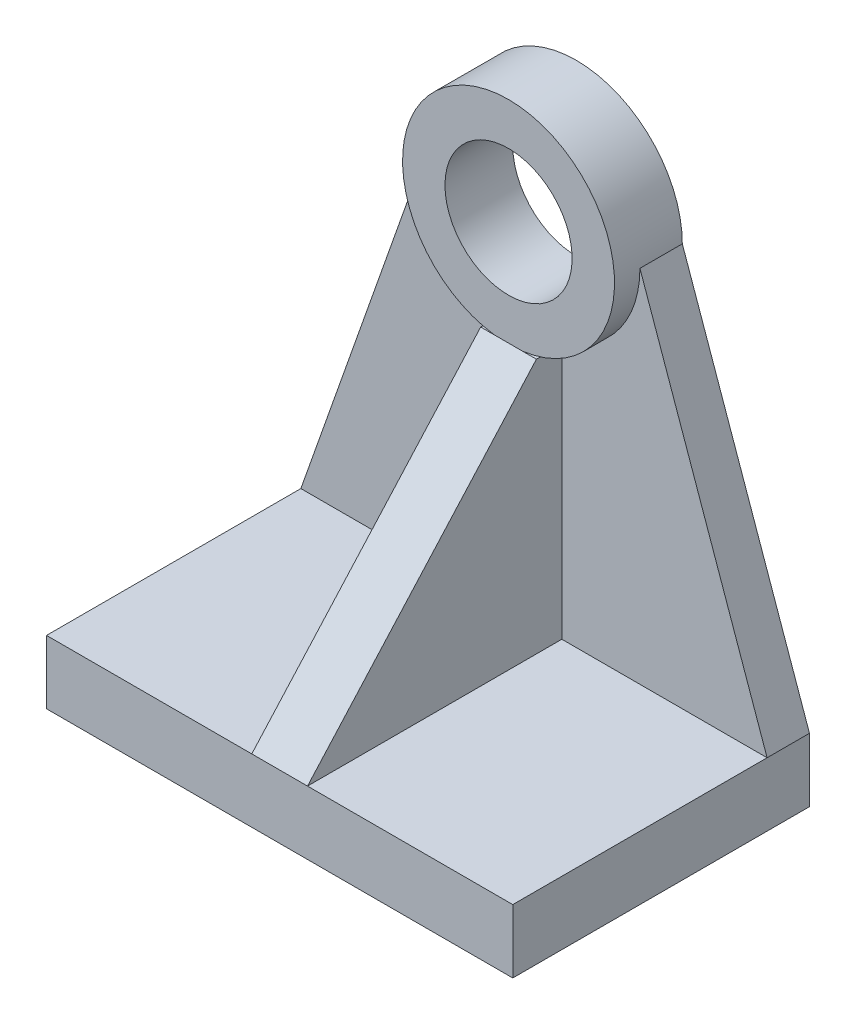
ISO-10303-21;
HEADER;
FILE_DESCRIPTION(('STEP AP214'),'2;1');
FILE_NAME('part.step','',(''),(''),'','','');
FILE_SCHEMA(('AUTOMOTIVE_DESIGN { 1 0 10303 214 1 1 1 1 }'));
ENDSEC;
DATA;
#1=APPLICATION_CONTEXT('core data for automotive mechanical design processes');
#2=APPLICATION_PROTOCOL_DEFINITION('international standard','automotive_design',2000,#1);
#3=PRODUCT_CONTEXT('',#1,'mechanical');
#4=PRODUCT('Part','Part','',(#3));
#5=PRODUCT_RELATED_PRODUCT_CATEGORY('part','',(#4));
#6=PRODUCT_DEFINITION_FORMATION('','',#4);
#7=PRODUCT_DEFINITION_CONTEXT('part definition',#1,'design');
#8=PRODUCT_DEFINITION('design','',#6,#7);
#9=PRODUCT_DEFINITION_SHAPE('','',#8);
#10=(LENGTH_UNIT() NAMED_UNIT(*) SI_UNIT(.MILLI.,.METRE.));
#11=(NAMED_UNIT(*) PLANE_ANGLE_UNIT() SI_UNIT($,.RADIAN.));
#12=(NAMED_UNIT(*) SI_UNIT($,.STERADIAN.) SOLID_ANGLE_UNIT());
#13=UNCERTAINTY_MEASURE_WITH_UNIT(LENGTH_MEASURE(1.E-05),#10,'distance_accuracy_value','');
#14=(GEOMETRIC_REPRESENTATION_CONTEXT(3) GLOBAL_UNCERTAINTY_ASSIGNED_CONTEXT((#13)) GLOBAL_UNIT_ASSIGNED_CONTEXT((#10,
#11,#12)) REPRESENTATION_CONTEXT('',''));
#15=CARTESIAN_POINT('',(0.,0.,0.));
#16=DIRECTION('',(0.,0.,1.));
#17=DIRECTION('',(1.,0.,0.));
#18=AXIS2_PLACEMENT_3D('',#15,#16,#17);
#19=CARTESIAN_POINT('',(0.,95.5294,0.));
#20=DIRECTION('',(0.,-1.,0.));
#21=DIRECTION('',(0.,0.,-1.));
#22=AXIS2_PLACEMENT_3D('',#19,#20,#21);
#23=PLANE('',#22);
#24=DIRECTION('',(0.,0.,1.));
#25=VECTOR('',#24,1.);
#26=CARTESIAN_POINT('',(-8.34981821548547,95.5294,-31.75));
#27=LINE('',#26,#25);
#28=CARTESIAN_POINT('',(-8.34981821548547,95.5294,-31.75));
#29=VERTEX_POINT('',#28);
#30=CARTESIAN_POINT('',(-8.34981821548547,95.5294,-24.13));
#31=VERTEX_POINT('',#30);
#32=EDGE_CURVE('E143',#29,#31,#27,.T.);
#33=ORIENTED_EDGE('',*,*,#32,.T.);
#34=DIRECTION('',(1.,0.,0.));
#35=VECTOR('',#34,1.);
#36=CARTESIAN_POINT('',(0.,95.5294,-24.13));
#37=LINE('',#36,#35);
#38=CARTESIAN_POINT('',(-4.20283661828531,95.5294,-24.13));
#39=VERTEX_POINT('',#38);
#40=EDGE_CURVE('E11',#31,#39,#37,.T.);
#41=ORIENTED_EDGE('',*,*,#40,.T.);
#42=DIRECTION('',(0.,0.,-1.));
#43=VECTOR('',#42,1.);
#44=CARTESIAN_POINT('',(-4.20283661828531,95.5294,-24.13));
#45=LINE('',#44,#43);
#46=CARTESIAN_POINT('',(-4.20283661828531,95.5294,-31.75));
#47=VERTEX_POINT('',#46);
#48=EDGE_CURVE('E165',#47,#39,#45,.F.);
#49=ORIENTED_EDGE('',*,*,#48,.F.);
#50=DIRECTION('',(-1.,0.,0.));
#51=VECTOR('',#50,1.);
#52=CARTESIAN_POINT('',(-8.34981821548547,95.5294,-31.75));
#53=LINE('',#52,#51);
#54=EDGE_CURVE('E148',#47,#29,#53,.T.);
#55=ORIENTED_EDGE('',*,*,#54,.T.);
#56=EDGE_LOOP('',(#33,#41,#49,#55));
#57=FACE_BOUND('',#56,.T.);
#58=ADVANCED_FACE('F35',(#57),#23,.F.);
#59=CARTESIAN_POINT('',(0.,19.05,0.));
#60=DIRECTION('',(0.,-1.,0.));
#61=DIRECTION('',(0.,0.,-1.));
#62=AXIS2_PLACEMENT_3D('',#59,#60,#61);
#63=PLANE('',#62);
#64=DIRECTION('',(0.,0.,1.));
#65=VECTOR('',#64,1.);
#66=CARTESIAN_POINT('',(-8.34981821548547,19.05,-31.75));
#67=LINE('',#66,#65);
#68=CARTESIAN_POINT('',(-8.34981821548547,19.05,-31.75));
#69=VERTEX_POINT('',#68);
#70=CARTESIAN_POINT('',(-8.34981821548547,19.05,44.45));
#71=VERTEX_POINT('',#70);
#72=EDGE_CURVE('E144',#69,#71,#67,.T.);
#73=ORIENTED_EDGE('',*,*,#72,.F.);
#74=DIRECTION('',(-1.,0.,0.));
#75=VECTOR('',#74,1.);
#76=CARTESIAN_POINT('',(0.,19.05,-31.75));
#77=LINE('',#76,#75);
#78=CARTESIAN_POINT('',(-69.85,19.05,-31.75));
#79=VERTEX_POINT('',#78);
#80=EDGE_CURVE('E188',#69,#79,#77,.T.);
#81=ORIENTED_EDGE('',*,*,#80,.T.);
#82=DIRECTION('',(0.,0.,1.));
#83=VECTOR('',#82,1.);
#84=CARTESIAN_POINT('',(-69.85,19.05,44.45));
#85=LINE('',#84,#83);
#86=CARTESIAN_POINT('',(-69.85,19.05,44.45));
#87=VERTEX_POINT('',#86);
#88=EDGE_CURVE('E211',#79,#87,#85,.T.);
#89=ORIENTED_EDGE('',*,*,#88,.T.);
#90=DIRECTION('',(1.,0.,0.));
#91=VECTOR('',#90,1.);
#92=CARTESIAN_POINT('',(-69.85,19.05,44.45));
#93=LINE('',#92,#91);
#94=EDGE_CURVE('E217',#87,#71,#93,.T.);
#95=ORIENTED_EDGE('',*,*,#94,.T.);
#96=EDGE_LOOP('',(#73,#81,#89,#95));
#97=FACE_BOUND('',#96,.T.);
#98=ADVANCED_FACE('F288',(#97),#63,.F.);
#99=DIRECTION('',(0.,0.,-1.));
#100=VECTOR('',#99,1.);
#101=CARTESIAN_POINT('',(8.34981821548553,19.05,-31.75));
#102=LINE('',#101,#100);
#103=CARTESIAN_POINT('',(8.34981821548553,19.05,44.45));
#104=VERTEX_POINT('',#103);
#105=CARTESIAN_POINT('',(8.34981821548553,19.05,-31.75));
#106=VERTEX_POINT('',#105);
#107=EDGE_CURVE('E157',#104,#106,#102,.T.);
#108=ORIENTED_EDGE('',*,*,#107,.F.);
#109=CARTESIAN_POINT('',(69.85,19.05,44.45));
#110=VERTEX_POINT('',#109);
#111=EDGE_CURVE('E216',#104,#110,#93,.T.);
#112=ORIENTED_EDGE('',*,*,#111,.T.);
#113=DIRECTION('',(0.,0.,-1.));
#114=VECTOR('',#113,1.);
#115=CARTESIAN_POINT('',(69.85,19.05,44.45));
#116=LINE('',#115,#114);
#117=CARTESIAN_POINT('',(69.85,19.05,-31.75));
#118=VERTEX_POINT('',#117);
#119=EDGE_CURVE('E208',#110,#118,#116,.T.);
#120=ORIENTED_EDGE('',*,*,#119,.T.);
#121=EDGE_CURVE('E189',#118,#106,#77,.T.);
#122=ORIENTED_EDGE('',*,*,#121,.T.);
#123=EDGE_LOOP('',(#108,#112,#120,#122));
#124=FACE_BOUND('',#123,.T.);
#125=ADVANCED_FACE('F248',(#124),#63,.F.);
#126=CARTESIAN_POINT('',(0.,0.,-31.75));
#127=DIRECTION('',(0.,0.,-1.));
#128=DIRECTION('',(-1.,0.,0.));
#129=AXIS2_PLACEMENT_3D('',#126,#127,#128);
#130=PLANE('',#129);
#131=DIRECTION('',(0.,-1.,0.));
#132=VECTOR('',#131,1.);
#133=CARTESIAN_POINT('',(8.34981821548553,95.5294,-31.75));
#134=LINE('',#133,#132);
#135=CARTESIAN_POINT('',(8.34981821548553,95.5294,-31.75));
#136=VERTEX_POINT('',#135);
#137=EDGE_CURVE('E151',#136,#106,#134,.T.);
#138=ORIENTED_EDGE('',*,*,#137,.T.);
#139=ORIENTED_EDGE('',*,*,#121,.F.);
#140=DIRECTION('',(0.332820117735138,-0.94299033358289,0.));
#141=VECTOR('',#140,1.);
#142=CARTESIAN_POINT('',(68.0915384615385,24.0323076923077,-31.75));
#143=LINE('',#142,#141);
#144=CARTESIAN_POINT('',(31.75,127.,-31.75));
#145=VERTEX_POINT('',#144);
#146=EDGE_CURVE('E184',#145,#118,#143,.T.);
#147=ORIENTED_EDGE('',*,*,#146,.F.);
#148=CARTESIAN_POINT('',(0.,127.,-31.75));
#149=DIRECTION('',(0.,0.,-1.));
#150=DIRECTION('',(-1.,0.,0.));
#151=AXIS2_PLACEMENT_3D('',#148,#149,#150);
#152=CIRCLE('',#151,31.75);
#153=CARTESIAN_POINT('',(4.20283661828531,95.5294,-31.75));
#154=VERTEX_POINT('',#153);
#155=EDGE_CURVE('E181',#145,#154,#152,.T.);
#156=ORIENTED_EDGE('',*,*,#155,.T.);
#157=EDGE_CURVE('E149',#136,#154,#53,.T.);
#158=ORIENTED_EDGE('',*,*,#157,.F.);
#159=EDGE_LOOP('',(#138,#139,#147,#156,#158));
#160=FACE_BOUND('',#159,.T.);
#161=ADVANCED_FACE('F245',(#160),#130,.F.);
#162=DIRECTION('',(0.,-1.,0.));
#163=VECTOR('',#162,1.);
#164=CARTESIAN_POINT('',(-8.34981821548547,95.5294,-31.75));
#165=LINE('',#164,#163);
#166=EDGE_CURVE('E161',#29,#69,#165,.T.);
#167=ORIENTED_EDGE('',*,*,#166,.F.);
#168=ORIENTED_EDGE('',*,*,#54,.F.);
#169=CARTESIAN_POINT('',(-31.75,127.,-31.75));
#170=VERTEX_POINT('',#169);
#171=EDGE_CURVE('E185',#47,#170,#152,.T.);
#172=ORIENTED_EDGE('',*,*,#171,.T.);
#173=DIRECTION('',(0.332820117735137,0.94299033358289,0.));
#174=VECTOR('',#173,1.);
#175=CARTESIAN_POINT('',(-68.0915384615384,24.0323076923077,-31.75));
#176=LINE('',#175,#174);
#177=EDGE_CURVE('E192',#79,#170,#176,.T.);
#178=ORIENTED_EDGE('',*,*,#177,.F.);
#179=ORIENTED_EDGE('',*,*,#80,.F.);
#180=EDGE_LOOP('',(#167,#168,#172,#178,#179));
#181=FACE_BOUND('',#180,.T.);
#182=ADVANCED_FACE('F275',(#181),#130,.F.);
#183=CARTESIAN_POINT('',(0.,127.,-24.13));
#184=DIRECTION('',(0.,0.,-1.));
#185=DIRECTION('',(-1.,0.,0.));
#186=AXIS2_PLACEMENT_3D('',#183,#184,#185);
#187=CYLINDRICAL_SURFACE('',#186,31.75);
#188=ORIENTED_EDGE('',*,*,#171,.F.);
#189=ORIENTED_EDGE('',*,*,#48,.T.);
#190=CARTESIAN_POINT('',(0.,127.,-24.13));
#191=DIRECTION('',(0.,0.,-1.));
#192=DIRECTION('',(-1.,0.,0.));
#193=AXIS2_PLACEMENT_3D('',#190,#191,#192);
#194=CIRCLE('',#193,31.75);
#195=CARTESIAN_POINT('',(4.20283661828531,95.5294,-24.13));
#196=VERTEX_POINT('',#195);
#197=EDGE_CURVE('E175',#39,#196,#194,.T.);
#198=ORIENTED_EDGE('',*,*,#197,.T.);
#199=DIRECTION('',(0.,0.,-1.));
#200=VECTOR('',#199,1.);
#201=CARTESIAN_POINT('',(4.20283661828531,95.5294,-24.13));
#202=LINE('',#201,#200);
#203=EDGE_CURVE('E163',#196,#154,#202,.T.);
#204=ORIENTED_EDGE('',*,*,#203,.T.);
#205=ORIENTED_EDGE('',*,*,#155,.F.);
#206=DIRECTION('',(0.,0.,-1.));
#207=VECTOR('',#206,1.);
#208=CARTESIAN_POINT('',(31.75,127.,-31.75));
#209=LINE('',#208,#207);
#210=CARTESIAN_POINT('',(31.75,127.,-44.45));
#211=VERTEX_POINT('',#210);
#212=EDGE_CURVE('E195',#145,#211,#209,.T.);
#213=ORIENTED_EDGE('',*,*,#212,.T.);
#214=CARTESIAN_POINT('',(0.,127.,-44.45));
#215=DIRECTION('',(0.,0.,-1.));
#216=DIRECTION('',(-1.,0.,0.));
#217=AXIS2_PLACEMENT_3D('',#214,#215,#216);
#218=CIRCLE('',#217,31.75);
#219=CARTESIAN_POINT('',(-31.75,127.,-44.45));
#220=VERTEX_POINT('',#219);
#221=EDGE_CURVE('E172',#220,#211,#218,.T.);
#222=ORIENTED_EDGE('',*,*,#221,.F.);
#223=DIRECTION('',(0.,0.,-1.));
#224=VECTOR('',#223,1.);
#225=CARTESIAN_POINT('',(-31.75,127.,-31.75));
#226=LINE('',#225,#224);
#227=EDGE_CURVE('E201',#170,#220,#226,.T.);
#228=ORIENTED_EDGE('',*,*,#227,.F.);
#229=EDGE_LOOP('',(#188,#189,#198,#204,#205,#213,#222,#228));
#230=FACE_BOUND('',#229,.T.);
#231=ADVANCED_FACE('F267',(#230),#187,.T.);
#232=CARTESIAN_POINT('',(0.,127.,-24.13));
#233=DIRECTION('',(0.,0.,-1.));
#234=DIRECTION('',(-1.,0.,0.));
#235=AXIS2_PLACEMENT_3D('',#232,#233,#234);
#236=PLANE('',#235);
#237=CARTESIAN_POINT('',(0.,127.,-24.13));
#238=DIRECTION('',(0.,0.,-1.));
#239=DIRECTION('',(-1.,0.,0.));
#240=AXIS2_PLACEMENT_3D('',#237,#238,#239);
#241=CIRCLE('',#240,19.05);
#242=CARTESIAN_POINT('',(-19.05,127.,-24.13));
#243=VERTEX_POINT('',#242);
#244=EDGE_CURVE('E169',#243,#243,#241,.T.);
#245=ORIENTED_EDGE('',*,*,#244,.T.);
#246=EDGE_LOOP('',(#245));
#247=FACE_BOUND('',#246,.T.);
#248=DIRECTION('',(-1.,0.,0.));
#249=VECTOR('',#248,1.);
#250=CARTESIAN_POINT('',(0.,95.5294,-24.13));
#251=LINE('',#250,#249);
#252=EDGE_CURVE('E133',#196,#39,#251,.T.);
#253=ORIENTED_EDGE('',*,*,#252,.F.);
#254=ORIENTED_EDGE('',*,*,#197,.F.);
#255=EDGE_LOOP('',(#253,#254));
#256=FACE_BOUND('',#255,.T.);
#257=ADVANCED_FACE('F277',(#247,#256),#236,.F.);
#258=CARTESIAN_POINT('',(69.85,19.05,44.45));
#259=DIRECTION('',(-1.,0.,0.));
#260=DIRECTION('',(0.,0.,1.));
#261=AXIS2_PLACEMENT_3D('',#258,#259,#260);
#262=PLANE('',#261);
#263=DIRECTION('',(0.,0.,-1.));
#264=VECTOR('',#263,1.);
#265=CARTESIAN_POINT('',(69.85,0.,44.45));
#266=LINE('',#265,#264);
#267=CARTESIAN_POINT('',(69.85,0.,44.45));
#268=VERTEX_POINT('',#267);
#269=CARTESIAN_POINT('',(69.85,0.,-44.45));
#270=VERTEX_POINT('',#269);
#271=EDGE_CURVE('E204',#268,#270,#266,.T.);
#272=ORIENTED_EDGE('',*,*,#271,.T.);
#273=DIRECTION('',(0.,-1.,0.));
#274=VECTOR('',#273,1.);
#275=CARTESIAN_POINT('',(69.85,19.05,-44.45));
#276=LINE('',#275,#274);
#277=CARTESIAN_POINT('',(69.85,19.05,-44.45));
#278=VERTEX_POINT('',#277);
#279=EDGE_CURVE('E236',#278,#270,#276,.T.);
#280=ORIENTED_EDGE('',*,*,#279,.F.);
#281=DIRECTION('',(0.,0.,-1.));
#282=VECTOR('',#281,1.);
#283=CARTESIAN_POINT('',(69.85,19.05,-31.75));
#284=LINE('',#283,#282);
#285=EDGE_CURVE('E205',#118,#278,#284,.T.);
#286=ORIENTED_EDGE('',*,*,#285,.F.);
#287=ORIENTED_EDGE('',*,*,#119,.F.);
#288=DIRECTION('',(0.,-1.,0.));
#289=VECTOR('',#288,1.);
#290=CARTESIAN_POINT('',(69.85,19.05,44.45));
#291=LINE('',#290,#289);
#292=EDGE_CURVE('E220',#110,#268,#291,.T.);
#293=ORIENTED_EDGE('',*,*,#292,.T.);
#294=EDGE_LOOP('',(#272,#280,#286,#287,#293));
#295=FACE_BOUND('',#294,.T.);
#296=ADVANCED_FACE('F37',(#295),#262,.F.);
#297=CARTESIAN_POINT('',(-69.85,19.05,-44.45));
#298=DIRECTION('',(0.,0.,1.));
#299=DIRECTION('',(1.,0.,0.));
#300=AXIS2_PLACEMENT_3D('',#297,#298,#299);
#301=PLANE('',#300);
#302=DIRECTION('',(-1.,0.,0.));
#303=VECTOR('',#302,1.);
#304=CARTESIAN_POINT('',(-69.85,0.,-44.45));
#305=LINE('',#304,#303);
#306=CARTESIAN_POINT('',(-69.85,0.,-44.45));
#307=VERTEX_POINT('',#306);
#308=EDGE_CURVE('E223',#270,#307,#305,.T.);
#309=ORIENTED_EDGE('',*,*,#308,.T.);
#310=DIRECTION('',(0.,-1.,0.));
#311=VECTOR('',#310,1.);
#312=CARTESIAN_POINT('',(-69.85,19.05,-44.45));
#313=LINE('',#312,#311);
#314=CARTESIAN_POINT('',(-69.85,19.05,-44.45));
#315=VERTEX_POINT('',#314);
#316=EDGE_CURVE('E233',#315,#307,#313,.T.);
#317=ORIENTED_EDGE('',*,*,#316,.F.);
#318=DIRECTION('',(0.332820117735137,0.94299033358289,0.));
#319=VECTOR('',#318,1.);
#320=CARTESIAN_POINT('',(-68.0915384615384,24.0323076923077,-44.45));
#321=LINE('',#320,#319);
#322=EDGE_CURVE('E198',#315,#220,#321,.T.);
#323=ORIENTED_EDGE('',*,*,#322,.T.);
#324=ORIENTED_EDGE('',*,*,#221,.T.);
#325=DIRECTION('',(0.332820117735138,-0.94299033358289,0.));
#326=VECTOR('',#325,1.);
#327=CARTESIAN_POINT('',(68.0915384615385,24.0323076923077,-44.45));
#328=LINE('',#327,#326);
#329=EDGE_CURVE('E178',#211,#278,#328,.T.);
#330=ORIENTED_EDGE('',*,*,#329,.T.);
#331=ORIENTED_EDGE('',*,*,#279,.T.);
#332=EDGE_LOOP('',(#309,#317,#323,#324,#330,#331));
#333=FACE_BOUND('',#332,.T.);
#334=CARTESIAN_POINT('',(0.,127.,-44.45));
#335=DIRECTION('',(0.,0.,-1.));
#336=DIRECTION('',(-1.,0.,0.));
#337=AXIS2_PLACEMENT_3D('',#334,#335,#336);
#338=CIRCLE('',#337,19.05);
#339=CARTESIAN_POINT('',(-19.05,127.,-44.45));
#340=VERTEX_POINT('',#339);
#341=EDGE_CURVE('E168',#340,#340,#338,.T.);
#342=ORIENTED_EDGE('',*,*,#341,.F.);
#343=EDGE_LOOP('',(#342));
#344=FACE_BOUND('',#343,.T.);
#345=ADVANCED_FACE('F261',(#333,#344),#301,.F.);
#346=CARTESIAN_POINT('',(-69.85,19.05,44.45));
#347=DIRECTION('',(1.,0.,0.));
#348=DIRECTION('',(0.,0.,-1.));
#349=AXIS2_PLACEMENT_3D('',#346,#347,#348);
#350=PLANE('',#349);
#351=DIRECTION('',(0.,0.,1.));
#352=VECTOR('',#351,1.);
#353=CARTESIAN_POINT('',(-69.85,0.,44.45));
#354=LINE('',#353,#352);
#355=CARTESIAN_POINT('',(-69.85,0.,44.45));
#356=VERTEX_POINT('',#355);
#357=EDGE_CURVE('E225',#307,#356,#354,.T.);
#358=ORIENTED_EDGE('',*,*,#357,.T.);
#359=DIRECTION('',(0.,-1.,0.));
#360=VECTOR('',#359,1.);
#361=CARTESIAN_POINT('',(-69.85,19.05,44.45));
#362=LINE('',#361,#360);
#363=EDGE_CURVE('E230',#87,#356,#362,.T.);
#364=ORIENTED_EDGE('',*,*,#363,.F.);
#365=ORIENTED_EDGE('',*,*,#88,.F.);
#366=EDGE_CURVE('E213',#315,#79,#85,.T.);
#367=ORIENTED_EDGE('',*,*,#366,.F.);
#368=ORIENTED_EDGE('',*,*,#316,.T.);
#369=EDGE_LOOP('',(#358,#364,#365,#367,#368));
#370=FACE_BOUND('',#369,.T.);
#371=ADVANCED_FACE('F317',(#370),#350,.F.);
#372=CARTESIAN_POINT('',(-69.85,19.05,44.45));
#373=DIRECTION('',(0.,0.,-1.));
#374=DIRECTION('',(-1.,0.,0.));
#375=AXIS2_PLACEMENT_3D('',#372,#373,#374);
#376=PLANE('',#375);
#377=ORIENTED_EDGE('',*,*,#111,.F.);
#378=DIRECTION('',(-1.,0.,0.));
#379=VECTOR('',#378,1.);
#380=CARTESIAN_POINT('',(8.66818178451455,19.05,44.45));
#381=LINE('',#380,#379);
#382=EDGE_CURVE('E145',#104,#71,#381,.T.);
#383=ORIENTED_EDGE('',*,*,#382,.T.);
#384=ORIENTED_EDGE('',*,*,#94,.F.);
#385=ORIENTED_EDGE('',*,*,#363,.T.);
#386=DIRECTION('',(1.,0.,0.));
#387=VECTOR('',#386,1.);
#388=CARTESIAN_POINT('',(-69.85,0.,44.45));
#389=LINE('',#388,#387);
#390=EDGE_CURVE('E212',#356,#268,#389,.T.);
#391=ORIENTED_EDGE('',*,*,#390,.T.);
#392=ORIENTED_EDGE('',*,*,#292,.F.);
#393=EDGE_LOOP('',(#377,#383,#384,#385,#391,#392));
#394=FACE_BOUND('',#393,.T.);
#395=ADVANCED_FACE('F321',(#394),#376,.F.);
#396=CARTESIAN_POINT('',(0.,0.,0.));
#397=DIRECTION('',(0.,-1.,0.));
#398=DIRECTION('',(0.,0.,-1.));
#399=AXIS2_PLACEMENT_3D('',#396,#397,#398);
#400=PLANE('',#399);
#401=ORIENTED_EDGE('',*,*,#271,.F.);
#402=ORIENTED_EDGE('',*,*,#390,.F.);
#403=ORIENTED_EDGE('',*,*,#357,.F.);
#404=ORIENTED_EDGE('',*,*,#308,.F.);
#405=EDGE_LOOP('',(#401,#402,#403,#404));
#406=FACE_BOUND('',#405,.T.);
#407=ADVANCED_FACE('F327',(#406),#400,.T.);
#408=CARTESIAN_POINT('',(-68.0915384615384,24.0323076923077,-31.75));
#409=DIRECTION('',(-0.94299033358289,0.332820117735137,0.));
#410=DIRECTION('',(-0.332820117735137,-0.94299033358289,0.));
#411=AXIS2_PLACEMENT_3D('',#408,#409,#410);
#412=PLANE('',#411);
#413=ORIENTED_EDGE('',*,*,#322,.F.);
#414=ORIENTED_EDGE('',*,*,#366,.T.);
#415=ORIENTED_EDGE('',*,*,#177,.T.);
#416=ORIENTED_EDGE('',*,*,#227,.T.);
#417=EDGE_LOOP('',(#413,#414,#415,#416));
#418=FACE_BOUND('',#417,.T.);
#419=ADVANCED_FACE('F269',(#418),#412,.T.);
#420=CARTESIAN_POINT('',(68.0915384615385,24.0323076923077,-31.75));
#421=DIRECTION('',(0.942990333582889,0.332820117735138,0.));
#422=DIRECTION('',(-0.332820117735138,0.94299033358289,0.));
#423=AXIS2_PLACEMENT_3D('',#420,#421,#422);
#424=PLANE('',#423);
#425=ORIENTED_EDGE('',*,*,#329,.F.);
#426=ORIENTED_EDGE('',*,*,#212,.F.);
#427=ORIENTED_EDGE('',*,*,#146,.T.);
#428=ORIENTED_EDGE('',*,*,#285,.T.);
#429=EDGE_LOOP('',(#425,#426,#427,#428));
#430=FACE_BOUND('',#429,.T.);
#431=ADVANCED_FACE('F258',(#430),#424,.T.);
#432=CARTESIAN_POINT('',(0.,127.,-24.13));
#433=DIRECTION('',(0.,0.,-1.));
#434=DIRECTION('',(-1.,0.,0.));
#435=AXIS2_PLACEMENT_3D('',#432,#433,#434);
#436=CYLINDRICAL_SURFACE('',#435,19.05);
#437=ORIENTED_EDGE('',*,*,#244,.F.);
#438=EDGE_LOOP('',(#437));
#439=FACE_BOUND('',#438,.T.);
#440=ORIENTED_EDGE('',*,*,#341,.T.);
#441=EDGE_LOOP('',(#440));
#442=FACE_BOUND('',#441,.T.);
#443=ADVANCED_FACE('F305',(#439,#442),#436,.F.);
#444=CARTESIAN_POINT('',(-8.34981821548547,95.5294,-31.75));
#445=DIRECTION('',(1.,0.,0.));
#446=DIRECTION('',(0.,0.,-1.));
#447=AXIS2_PLACEMENT_3D('',#444,#445,#446);
#448=PLANE('',#447);
#449=ORIENTED_EDGE('',*,*,#72,.T.);
#450=DIRECTION('',(0.,-0.744510107528483,0.667611189082333));
#451=VECTOR('',#450,1.);
#452=CARTESIAN_POINT('',(-8.34981821548547,95.5294,-24.13));
#453=LINE('',#452,#451);
#454=EDGE_CURVE('E130',#31,#71,#453,.T.);
#455=ORIENTED_EDGE('',*,*,#454,.F.);
#456=ORIENTED_EDGE('',*,*,#32,.F.);
#457=ORIENTED_EDGE('',*,*,#166,.T.);
#458=EDGE_LOOP('',(#449,#455,#456,#457));
#459=FACE_BOUND('',#458,.T.);
#460=ADVANCED_FACE('F141',(#459),#448,.F.);
#461=CARTESIAN_POINT('',(8.34981821548553,95.5294,-31.75));
#462=DIRECTION('',(-1.,0.,0.));
#463=DIRECTION('',(0.,0.,1.));
#464=AXIS2_PLACEMENT_3D('',#461,#462,#463);
#465=PLANE('',#464);
#466=DIRECTION('',(0.,0.,-1.));
#467=VECTOR('',#466,1.);
#468=CARTESIAN_POINT('',(8.34981821548553,95.5294,-31.75));
#469=LINE('',#468,#467);
#470=CARTESIAN_POINT('',(8.34981821548553,95.5294,-24.13));
#471=VERTEX_POINT('',#470);
#472=EDGE_CURVE('E57',#471,#136,#469,.T.);
#473=ORIENTED_EDGE('',*,*,#472,.F.);
#474=DIRECTION('',(0.,-0.744510107528483,0.667611189082333));
#475=VECTOR('',#474,1.);
#476=CARTESIAN_POINT('',(8.34981821548553,99.3168697796623,-27.526269812384));
#477=LINE('',#476,#475);
#478=EDGE_CURVE('E50',#471,#104,#477,.T.);
#479=ORIENTED_EDGE('',*,*,#478,.T.);
#480=ORIENTED_EDGE('',*,*,#107,.T.);
#481=ORIENTED_EDGE('',*,*,#137,.F.);
#482=EDGE_LOOP('',(#473,#479,#480,#481));
#483=FACE_BOUND('',#482,.T.);
#484=ADVANCED_FACE('F242',(#483),#465,.F.);
#485=ORIENTED_EDGE('',*,*,#203,.F.);
#486=EDGE_CURVE('E39',#196,#471,#37,.T.);
#487=ORIENTED_EDGE('',*,*,#486,.T.);
#488=ORIENTED_EDGE('',*,*,#472,.T.);
#489=ORIENTED_EDGE('',*,*,#157,.T.);
#490=EDGE_LOOP('',(#485,#487,#488,#489));
#491=FACE_BOUND('',#490,.T.);
#492=ADVANCED_FACE('F239',(#491),#23,.F.);
#493=CARTESIAN_POINT('',(8.66818178451455,95.5294,-24.13));
#494=DIRECTION('',(0.,-0.667611189082333,-0.744510107528483));
#495=DIRECTION('',(0.,0.744510107528483,-0.667611189082333));
#496=AXIS2_PLACEMENT_3D('',#493,#494,#495);
#497=PLANE('',#496);
#498=ORIENTED_EDGE('',*,*,#486,.F.);
#499=ORIENTED_EDGE('',*,*,#252,.T.);
#500=ORIENTED_EDGE('',*,*,#40,.F.);
#501=ORIENTED_EDGE('',*,*,#454,.T.);
#502=ORIENTED_EDGE('',*,*,#382,.F.);
#503=ORIENTED_EDGE('',*,*,#478,.F.);
#504=EDGE_LOOP('',(#498,#499,#500,#501,#502,#503));
#505=FACE_BOUND('',#504,.T.);
#506=ADVANCED_FACE('F129',(#505),#497,.F.);
#507=CLOSED_SHELL('',(#58,#98,#125,#161,#182,#231,#257,#296,#345,#371,#395,#407,#419,#431,#443,
#460,#484,#492,#506));
#508=MANIFOLD_SOLID_BREP('B2',#507);
#509=ADVANCED_BREP_SHAPE_REPRESENTATION('',(#18,#508),#14);
#510=SHAPE_DEFINITION_REPRESENTATION(#9,#509);
ENDSEC;
END-ISO-10303-21;
